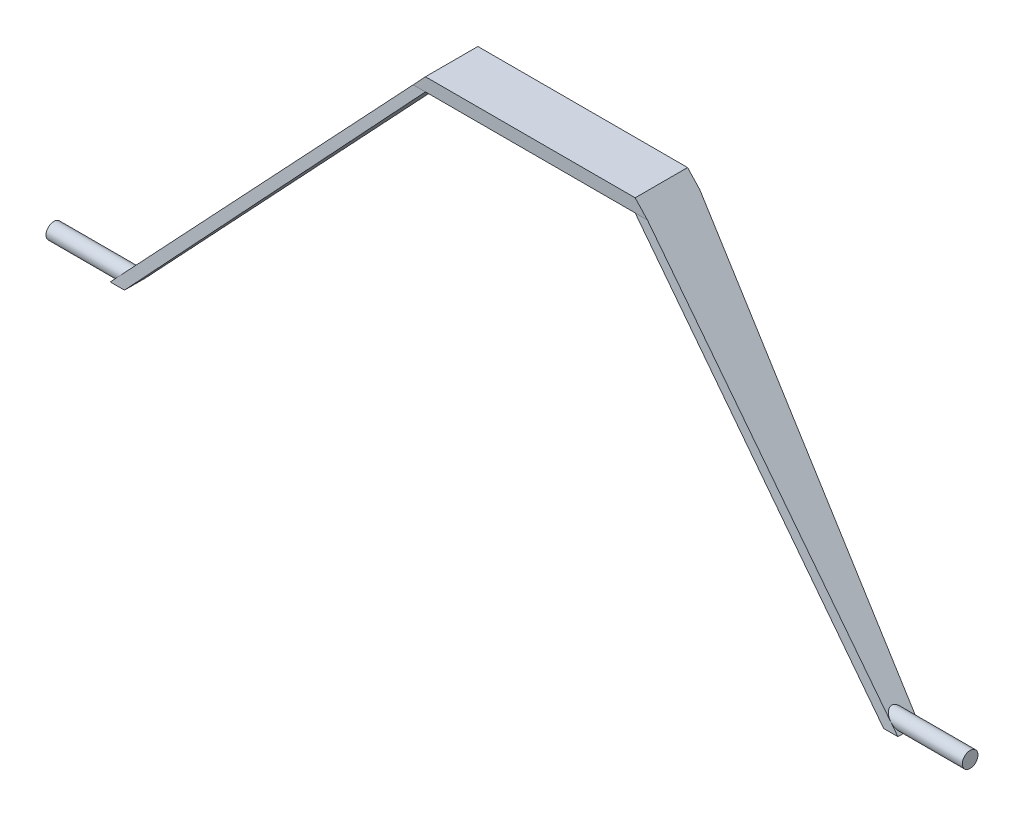
ISO-10303-21;
HEADER;
FILE_DESCRIPTION(('STEP AP214'),'2;1');
FILE_NAME('part.step','',(''),(''),'','','');
FILE_SCHEMA(('AUTOMOTIVE_DESIGN { 1 0 10303 214 1 1 1 1 }'));
ENDSEC;
DATA;
#1=APPLICATION_CONTEXT('core data for automotive mechanical design processes');
#2=APPLICATION_PROTOCOL_DEFINITION('international standard','automotive_design',2000,#1);
#3=PRODUCT_CONTEXT('',#1,'mechanical');
#4=PRODUCT('Part','Part','',(#3));
#5=PRODUCT_RELATED_PRODUCT_CATEGORY('part','',(#4));
#6=PRODUCT_DEFINITION_FORMATION('','',#4);
#7=PRODUCT_DEFINITION_CONTEXT('part definition',#1,'design');
#8=PRODUCT_DEFINITION('design','',#6,#7);
#9=PRODUCT_DEFINITION_SHAPE('','',#8);
#10=(LENGTH_UNIT() NAMED_UNIT(*) SI_UNIT(.MILLI.,.METRE.));
#11=(NAMED_UNIT(*) PLANE_ANGLE_UNIT() SI_UNIT($,.RADIAN.));
#12=(NAMED_UNIT(*) SI_UNIT($,.STERADIAN.) SOLID_ANGLE_UNIT());
#13=UNCERTAINTY_MEASURE_WITH_UNIT(LENGTH_MEASURE(1.E-05),#10,'distance_accuracy_value','');
#14=(GEOMETRIC_REPRESENTATION_CONTEXT(3) GLOBAL_UNCERTAINTY_ASSIGNED_CONTEXT((#13)) GLOBAL_UNIT_ASSIGNED_CONTEXT((#10,
#11,#12)) REPRESENTATION_CONTEXT('',''));
#15=CARTESIAN_POINT('',(0.,0.,0.));
#16=DIRECTION('',(0.,0.,1.));
#17=DIRECTION('',(1.,0.,0.));
#18=AXIS2_PLACEMENT_3D('',#15,#16,#17);
#19=CARTESIAN_POINT('',(-203.2,241.3,-101.6));
#20=DIRECTION('',(-0.730491181160132,0.682922128977583,0.));
#21=DIRECTION('',(-0.682922128977583,-0.730491181160132,0.));
#22=AXIS2_PLACEMENT_3D('',#19,#20,#21);
#23=PLANE('',#22);
#24=DIRECTION('',(0.,0.,-1.));
#25=VECTOR('',#24,1.);
#26=CARTESIAN_POINT('',(-763.250773789481,-357.761201703354,-101.600000000001));
#27=LINE('',#26,#25);
#28=CARTESIAN_POINT('',(-763.250773789482,-357.761201703355,50.8198320375984));
#29=VERTEX_POINT('',#28);
#30=CARTESIAN_POINT('',(-763.250773789482,-357.761201703355,34.29));
#31=VERTEX_POINT('',#30);
#32=EDGE_CURVE('E317',#29,#31,#27,.T.);
#33=ORIENTED_EDGE('',*,*,#32,.F.);
#34=DIRECTION('',(0.681496635621806,0.728966394832361,-0.0645780987740409));
#35=VECTOR('',#34,1.);
#36=CARTESIAN_POINT('',(-723.937929376007,-315.71001470586,47.094577037175));
#37=LINE('',#36,#35);
#38=CARTESIAN_POINT('',(-749.529378710232,-343.084040613829,49.519603158351));
#39=VERTEX_POINT('',#38);
#40=EDGE_CURVE('E193',#29,#39,#37,.T.);
#41=ORIENTED_EDGE('',*,*,#40,.T.);
#42=CARTESIAN_POINT('',(-749.003191458523,-342.521201703355,34.29));
#43=DIRECTION('',(-0.730491181160132,0.682922128977583,0.));
#44=DIRECTION('',(-0.682922128977583,-0.730491181160132,0.));
#45=AXIS2_PLACEMENT_3D('',#42,#43,#44);
#46=ELLIPSE('',#45,20.8626748591222,15.24);
#47=EDGE_CURVE('E173',#31,#39,#46,.T.);
#48=ORIENTED_EDGE('',*,*,#47,.F.);
#49=EDGE_LOOP('',(#33,#41,#48));
#50=FACE_BOUND('',#49,.T.);
#51=ADVANCED_FACE('F41',(#50),#23,.T.);
#52=CARTESIAN_POINT('',(203.2,241.3,-101.6));
#53=DIRECTION('',(0.730491181160132,0.682922128977584,0.));
#54=DIRECTION('',(-0.682922128977584,0.730491181160132,0.));
#55=AXIS2_PLACEMENT_3D('',#52,#53,#54);
#56=PLANE('',#55);
#57=DIRECTION('',(0.,0.,1.));
#58=VECTOR('',#57,1.);
#59=CARTESIAN_POINT('',(763.250773789482,-357.761201703355,-101.600000000001));
#60=LINE('',#59,#58);
#61=CARTESIAN_POINT('',(763.250773789482,-357.761201703355,9.71963208235841));
#62=VERTEX_POINT('',#61);
#63=CARTESIAN_POINT('',(763.250773789482,-357.761201703355,33.0074609456695));
#64=VERTEX_POINT('',#63);
#65=EDGE_CURVE('E140',#62,#64,#60,.T.);
#66=ORIENTED_EDGE('',*,*,#65,.F.);
#67=DIRECTION('',(0.676162571687912,-0.723260785805915,0.140349607636784));
#68=VECTOR('',#67,1.);
#69=CARTESIAN_POINT('',(716.188478747164,-307.420774830618,-0.0489870637551265));
#70=LINE('',#69,#68);
#71=CARTESIAN_POINT('',(226.945970551598,215.9,-101.6));
#72=VERTEX_POINT('',#71);
#73=EDGE_CURVE('E153',#72,#62,#70,.T.);
#74=ORIENTED_EDGE('',*,*,#73,.F.);
#75=DIRECTION('',(-0.682922128977583,0.730491181160132,0.));
#76=VECTOR('',#75,1.);
#77=CARTESIAN_POINT('',(203.2,241.3,-101.6));
#78=LINE('',#77,#76);
#79=CARTESIAN_POINT('',(203.2,241.3,-101.6));
#80=VERTEX_POINT('',#79);
#81=EDGE_CURVE('E227',#72,#80,#78,.T.);
#82=ORIENTED_EDGE('',*,*,#81,.T.);
#83=DIRECTION('',(0.,0.,1.));
#84=VECTOR('',#83,1.);
#85=CARTESIAN_POINT('',(203.2,241.3,-101.6));
#86=LINE('',#85,#84);
#87=CARTESIAN_POINT('',(203.2,241.3,0.));
#88=VERTEX_POINT('',#87);
#89=EDGE_CURVE('E239',#80,#88,#86,.T.);
#90=ORIENTED_EDGE('',*,*,#89,.T.);
#91=DIRECTION('',(-0.682922128977584,0.730491181160132,0.));
#92=VECTOR('',#91,1.);
#93=CARTESIAN_POINT('',(713.347967728877,-304.382407554465,0.));
#94=LINE('',#93,#92);
#95=CARTESIAN_POINT('',(226.945970551598,215.9,0.));
#96=VERTEX_POINT('',#95);
#97=EDGE_CURVE('E179',#96,#88,#94,.T.);
#98=ORIENTED_EDGE('',*,*,#97,.F.);
#99=DIRECTION('',(-0.681496635621806,0.728966394832361,-0.0645780987740408));
#100=VECTOR('',#99,1.);
#101=CARTESIAN_POINT('',(723.937929376008,-315.71001470586,47.094577037175));
#102=LINE('',#101,#100);
#103=CARTESIAN_POINT('',(763.250773789482,-357.761201703355,50.8198320375984));
#104=VERTEX_POINT('',#103);
#105=EDGE_CURVE('E181',#104,#96,#102,.T.);
#106=ORIENTED_EDGE('',*,*,#105,.F.);
#107=CARTESIAN_POINT('',(763.250773789482,-357.761201703355,35.2279876970949));
#108=VERTEX_POINT('',#107);
#109=EDGE_CURVE('E159',#108,#104,#60,.T.);
#110=ORIENTED_EDGE('',*,*,#109,.F.);
#111=CARTESIAN_POINT('',(749.041050591846,-342.561697920778,34.1177243213822));
#112=DIRECTION('',(0.730491181160132,0.682922128977584,0.));
#113=DIRECTION('',(0.682922128977584,-0.730491181160132,0.));
#114=AXIS2_PLACEMENT_3D('',#111,#112,#113);
#115=ELLIPSE('',#114,20.8626748591222,15.24);
#116=EDGE_CURVE('E50',#108,#64,#115,.F.);
#117=ORIENTED_EDGE('',*,*,#116,.T.);
#118=EDGE_LOOP('',(#66,#74,#82,#90,#98,#106,#110,#117));
#119=FACE_BOUND('',#118,.T.);
#120=ADVANCED_FACE('F152',(#119),#56,.T.);
#121=CARTESIAN_POINT('',(-763.250773789481,-357.761201703355,9.71963208235839));
#122=VERTEX_POINT('',#121);
#123=EDGE_CURVE('E57',#31,#122,#27,.T.);
#124=ORIENTED_EDGE('',*,*,#123,.F.);
#125=CARTESIAN_POINT('',(-745.982218014503,-339.289801861796,49.1834769299843));
#126=VERTEX_POINT('',#125);
#127=EDGE_CURVE('E166',#126,#31,#46,.T.);
#128=ORIENTED_EDGE('',*,*,#127,.F.);
#129=CARTESIAN_POINT('',(-226.945970551598,215.9,0.));
#130=VERTEX_POINT('',#129);
#131=EDGE_CURVE('E184',#126,#130,#37,.T.);
#132=ORIENTED_EDGE('',*,*,#131,.T.);
#133=DIRECTION('',(0.682922128977583,0.730491181160132,0.));
#134=VECTOR('',#133,1.);
#135=CARTESIAN_POINT('',(-713.347967728877,-304.382407554465,0.));
#136=LINE('',#135,#134);
#137=CARTESIAN_POINT('',(-203.2,241.3,0.));
#138=VERTEX_POINT('',#137);
#139=EDGE_CURVE('E187',#130,#138,#136,.T.);
#140=ORIENTED_EDGE('',*,*,#139,.T.);
#141=DIRECTION('',(0.,0.,1.));
#142=VECTOR('',#141,1.);
#143=CARTESIAN_POINT('',(-203.2,241.3,-101.6));
#144=LINE('',#143,#142);
#145=CARTESIAN_POINT('',(-203.2,241.3,-101.6));
#146=VERTEX_POINT('',#145);
#147=EDGE_CURVE('E235',#146,#138,#144,.T.);
#148=ORIENTED_EDGE('',*,*,#147,.F.);
#149=DIRECTION('',(-0.682922128977583,-0.730491181160132,0.));
#150=VECTOR('',#149,1.);
#151=CARTESIAN_POINT('',(-203.2,241.3,-101.6));
#152=LINE('',#151,#150);
#153=CARTESIAN_POINT('',(-226.945970551598,215.9,-101.6));
#154=VERTEX_POINT('',#153);
#155=EDGE_CURVE('E219',#146,#154,#152,.T.);
#156=ORIENTED_EDGE('',*,*,#155,.T.);
#157=DIRECTION('',(-0.676162571687912,-0.723260785805915,0.140349607636784));
#158=VECTOR('',#157,1.);
#159=CARTESIAN_POINT('',(-716.188478747163,-307.420774830618,-0.048987063755182));
#160=LINE('',#159,#158);
#161=EDGE_CURVE('E170',#154,#122,#160,.T.);
#162=ORIENTED_EDGE('',*,*,#161,.T.);
#163=EDGE_LOOP('',(#124,#128,#132,#140,#148,#156,#162));
#164=FACE_BOUND('',#163,.T.);
#165=ADVANCED_FACE('F43',(#164),#23,.T.);
#166=CARTESIAN_POINT('',(-203.2,241.3,-101.6));
#167=DIRECTION('',(0.,1.,0.));
#168=DIRECTION('',(-1.,0.,0.));
#169=AXIS2_PLACEMENT_3D('',#166,#167,#168);
#170=PLANE('',#169);
#171=DIRECTION('',(1.,0.,0.));
#172=VECTOR('',#171,1.);
#173=CARTESIAN_POINT('',(-1297.03997230565,241.3,0.));
#174=LINE('',#173,#172);
#175=EDGE_CURVE('E191',#138,#88,#174,.T.);
#176=ORIENTED_EDGE('',*,*,#175,.T.);
#177=ORIENTED_EDGE('',*,*,#89,.F.);
#178=DIRECTION('',(-1.,0.,0.));
#179=VECTOR('',#178,1.);
#180=CARTESIAN_POINT('',(-203.2,241.3,-101.6));
#181=LINE('',#180,#179);
#182=EDGE_CURVE('E230',#80,#146,#181,.T.);
#183=ORIENTED_EDGE('',*,*,#182,.T.);
#184=ORIENTED_EDGE('',*,*,#147,.T.);
#185=EDGE_LOOP('',(#176,#177,#183,#184));
#186=FACE_BOUND('',#185,.T.);
#187=ADVANCED_FACE('F298',(#186),#170,.T.);
#188=CARTESIAN_POINT('',(762.071663752112,-386.209201703355,-101.6));
#189=DIRECTION('',(-0.732932920293633,-0.680300914559025,0.));
#190=DIRECTION('',(0.680300914559025,-0.732932920293633,0.));
#191=AXIS2_PLACEMENT_3D('',#188,#189,#190);
#192=PLANE('',#191);
#193=DIRECTION('',(0.,0.,-1.));
#194=VECTOR('',#193,1.);
#195=CARTESIAN_POINT('',(735.666518231262,-357.761201703355,-101.6));
#196=LINE('',#195,#194);
#197=CARTESIAN_POINT('',(735.666518231262,-357.761201703355,50.8198320375984));
#198=VERTEX_POINT('',#197);
#199=CARTESIAN_POINT('',(735.666518231262,-357.761201703355,9.71963208235841));
#200=VERTEX_POINT('',#199);
#201=EDGE_CURVE('E142',#198,#200,#196,.T.);
#202=ORIENTED_EDGE('',*,*,#201,.F.);
#203=DIRECTION('',(0.678871413535743,-0.731392824819506,0.0647930527643605));
#204=VECTOR('',#203,1.);
#205=CARTESIAN_POINT('',(755.256449466988,-378.866723100837,52.6895402369698));
#206=LINE('',#205,#204);
#207=CARTESIAN_POINT('',(203.2,215.9,0.));
#208=VERTEX_POINT('',#207);
#209=EDGE_CURVE('E208',#208,#198,#206,.T.);
#210=ORIENTED_EDGE('',*,*,#209,.F.);
#211=DIRECTION('',(0.,0.,1.));
#212=VECTOR('',#211,1.);
#213=CARTESIAN_POINT('',(203.2,215.9,-101.6));
#214=LINE('',#213,#212);
#215=CARTESIAN_POINT('',(203.2,215.9,-101.6));
#216=VERTEX_POINT('',#215);
#217=EDGE_CURVE('E243',#216,#208,#214,.T.);
#218=ORIENTED_EDGE('',*,*,#217,.F.);
#219=DIRECTION('',(-0.673522882906171,0.725630500986452,-0.140809453659583));
#220=VECTOR('',#219,1.);
#221=CARTESIAN_POINT('',(750.990746361577,-374.271000579751,12.9233780062889));
#222=LINE('',#221,#220);
#223=EDGE_CURVE('E216',#200,#216,#222,.T.);
#224=ORIENTED_EDGE('',*,*,#223,.F.);
#225=EDGE_LOOP('',(#202,#210,#218,#224));
#226=FACE_BOUND('',#225,.T.);
#227=ADVANCED_FACE('F290',(#226),#192,.T.);
#228=CARTESIAN_POINT('',(-203.2,215.9,-101.6));
#229=DIRECTION('',(0.,-1.,0.));
#230=DIRECTION('',(1.,0.,0.));
#231=AXIS2_PLACEMENT_3D('',#228,#229,#230);
#232=PLANE('',#231);
#233=DIRECTION('',(1.,0.,0.));
#234=VECTOR('',#233,1.);
#235=CARTESIAN_POINT('',(-1297.03997230565,215.9,0.));
#236=LINE('',#235,#234);
#237=CARTESIAN_POINT('',(-203.2,215.9,0.));
#238=VERTEX_POINT('',#237);
#239=EDGE_CURVE('E205',#238,#208,#236,.T.);
#240=ORIENTED_EDGE('',*,*,#239,.F.);
#241=DIRECTION('',(0.,0.,1.));
#242=VECTOR('',#241,1.);
#243=CARTESIAN_POINT('',(-203.2,215.9,-101.6));
#244=LINE('',#243,#242);
#245=CARTESIAN_POINT('',(-203.2,215.9,-101.6));
#246=VERTEX_POINT('',#245);
#247=EDGE_CURVE('E234',#246,#238,#244,.T.);
#248=ORIENTED_EDGE('',*,*,#247,.F.);
#249=DIRECTION('',(1.,0.,0.));
#250=VECTOR('',#249,1.);
#251=CARTESIAN_POINT('',(-203.2,215.9,-101.6));
#252=LINE('',#251,#250);
#253=EDGE_CURVE('E223',#246,#216,#252,.T.);
#254=ORIENTED_EDGE('',*,*,#253,.T.);
#255=ORIENTED_EDGE('',*,*,#217,.T.);
#256=EDGE_LOOP('',(#240,#248,#254,#255));
#257=FACE_BOUND('',#256,.T.);
#258=ADVANCED_FACE('F281',(#257),#232,.T.);
#259=CARTESIAN_POINT('',(-762.071663752112,-386.209201703355,-101.6));
#260=DIRECTION('',(0.732932920293634,-0.680300914559025,0.));
#261=DIRECTION('',(0.680300914559025,0.732932920293634,0.));
#262=AXIS2_PLACEMENT_3D('',#259,#260,#261);
#263=PLANE('',#262);
#264=DIRECTION('',(0.,0.,1.));
#265=VECTOR('',#264,1.);
#266=CARTESIAN_POINT('',(-735.666518231261,-357.761201703355,-101.6));
#267=LINE('',#266,#265);
#268=CARTESIAN_POINT('',(-735.666518231261,-357.761201703355,9.71963208235841));
#269=VERTEX_POINT('',#268);
#270=CARTESIAN_POINT('',(-735.666518231261,-357.761201703355,50.8198320375984));
#271=VERTEX_POINT('',#270);
#272=EDGE_CURVE('E277',#269,#271,#267,.T.);
#273=ORIENTED_EDGE('',*,*,#272,.F.);
#274=DIRECTION('',(-0.673522882906171,-0.725630500986452,0.140809453659583));
#275=VECTOR('',#274,1.);
#276=CARTESIAN_POINT('',(-750.990746361577,-374.271000579751,12.9233780062889));
#277=LINE('',#276,#275);
#278=EDGE_CURVE('E212',#246,#269,#277,.T.);
#279=ORIENTED_EDGE('',*,*,#278,.F.);
#280=ORIENTED_EDGE('',*,*,#247,.T.);
#281=DIRECTION('',(0.678871413535743,0.731392824819506,-0.0647930527643606));
#282=VECTOR('',#281,1.);
#283=CARTESIAN_POINT('',(-755.256449466988,-378.866723100838,52.6895402369698));
#284=LINE('',#283,#282);
#285=EDGE_CURVE('E201',#271,#238,#284,.T.);
#286=ORIENTED_EDGE('',*,*,#285,.F.);
#287=EDGE_LOOP('',(#273,#279,#280,#286));
#288=FACE_BOUND('',#287,.T.);
#289=ADVANCED_FACE('F275',(#288),#263,.T.);
#290=CARTESIAN_POINT('',(0.,0.,-101.6));
#291=DIRECTION('',(0.,0.,1.));
#292=DIRECTION('',(1.,0.,0.));
#293=AXIS2_PLACEMENT_3D('',#290,#291,#292);
#294=PLANE('',#293);
#295=ORIENTED_EDGE('',*,*,#81,.F.);
#296=DIRECTION('',(-1.,0.,0.));
#297=VECTOR('',#296,1.);
#298=CARTESIAN_POINT('',(0.,215.9,-101.6));
#299=LINE('',#298,#297);
#300=EDGE_CURVE('E163',#72,#216,#299,.T.);
#301=ORIENTED_EDGE('',*,*,#300,.T.);
#302=ORIENTED_EDGE('',*,*,#253,.F.);
#303=DIRECTION('',(1.,0.,0.));
#304=VECTOR('',#303,1.);
#305=CARTESIAN_POINT('',(-1297.03997230565,215.9,-101.6));
#306=LINE('',#305,#304);
#307=EDGE_CURVE('E165',#154,#246,#306,.T.);
#308=ORIENTED_EDGE('',*,*,#307,.F.);
#309=ORIENTED_EDGE('',*,*,#155,.F.);
#310=ORIENTED_EDGE('',*,*,#182,.F.);
#311=EDGE_LOOP('',(#295,#301,#302,#308,#309,#310));
#312=FACE_BOUND('',#311,.T.);
#313=ADVANCED_FACE('F284',(#312),#294,.F.);
#314=CARTESIAN_POINT('',(-1297.03997230565,215.9,0.));
#315=DIRECTION('',(0.,-0.0882429953418222,-0.996098977899839));
#316=DIRECTION('',(0.,0.996098977899839,-0.0882429953418222));
#317=AXIS2_PLACEMENT_3D('',#314,#315,#316);
#318=PLANE('',#317);
#319=ORIENTED_EDGE('',*,*,#209,.T.);
#320=DIRECTION('',(1.,0.,0.));
#321=VECTOR('',#320,1.);
#322=CARTESIAN_POINT('',(-1297.03997230565,-357.761201703355,50.8198320375984));
#323=LINE('',#322,#321);
#324=EDGE_CURVE('E158',#198,#104,#323,.T.);
#325=ORIENTED_EDGE('',*,*,#324,.T.);
#326=ORIENTED_EDGE('',*,*,#105,.T.);
#327=EDGE_CURVE('E196',#208,#96,#236,.T.);
#328=ORIENTED_EDGE('',*,*,#327,.F.);
#329=EDGE_LOOP('',(#319,#325,#326,#328));
#330=FACE_BOUND('',#329,.T.);
#331=ADVANCED_FACE('F293',(#330),#318,.F.);
#332=ORIENTED_EDGE('',*,*,#40,.F.);
#333=DIRECTION('',(1.,0.,0.));
#334=VECTOR('',#333,1.);
#335=CARTESIAN_POINT('',(-1297.03997230565,-357.761201703355,50.8198320375984));
#336=LINE('',#335,#334);
#337=EDGE_CURVE('E272',#29,#271,#336,.T.);
#338=ORIENTED_EDGE('',*,*,#337,.T.);
#339=ORIENTED_EDGE('',*,*,#285,.T.);
#340=EDGE_CURVE('E192',#130,#238,#236,.T.);
#341=ORIENTED_EDGE('',*,*,#340,.F.);
#342=ORIENTED_EDGE('',*,*,#131,.F.);
#343=EDGE_CURVE('E197',#39,#126,#37,.T.);
#344=ORIENTED_EDGE('',*,*,#343,.F.);
#345=EDGE_LOOP('',(#332,#338,#339,#341,#342,#344));
#346=FACE_BOUND('',#345,.T.);
#347=ADVANCED_FACE('F269',(#346),#318,.F.);
#348=CARTESIAN_POINT('',(-1297.03997230565,241.3,0.));
#349=DIRECTION('',(0.,0.,-1.));
#350=DIRECTION('',(-1.,0.,0.));
#351=AXIS2_PLACEMENT_3D('',#348,#349,#350);
#352=PLANE('',#351);
#353=ORIENTED_EDGE('',*,*,#340,.T.);
#354=ORIENTED_EDGE('',*,*,#239,.T.);
#355=ORIENTED_EDGE('',*,*,#327,.T.);
#356=ORIENTED_EDGE('',*,*,#97,.T.);
#357=ORIENTED_EDGE('',*,*,#175,.F.);
#358=ORIENTED_EDGE('',*,*,#139,.F.);
#359=EDGE_LOOP('',(#353,#354,#355,#356,#357,#358));
#360=FACE_BOUND('',#359,.T.);
#361=ADVANCED_FACE('F266',(#360),#352,.F.);
#362=CARTESIAN_POINT('',(-1297.03997230565,215.9,-101.6));
#363=DIRECTION('',(0.,0.190497645594452,0.981687652475557));
#364=DIRECTION('',(0.,-0.981687652475557,0.190497645594452));
#365=AXIS2_PLACEMENT_3D('',#362,#363,#364);
#366=PLANE('',#365);
#367=ORIENTED_EDGE('',*,*,#278,.T.);
#368=DIRECTION('',(-1.,0.,0.));
#369=VECTOR('',#368,1.);
#370=CARTESIAN_POINT('',(960.161483369765,-357.761201703355,9.71963208235841));
#371=LINE('',#370,#369);
#372=EDGE_CURVE('E147',#269,#122,#371,.T.);
#373=ORIENTED_EDGE('',*,*,#372,.T.);
#374=ORIENTED_EDGE('',*,*,#161,.F.);
#375=ORIENTED_EDGE('',*,*,#307,.T.);
#376=EDGE_LOOP('',(#367,#373,#374,#375));
#377=FACE_BOUND('',#376,.T.);
#378=ADVANCED_FACE('F301',(#377),#366,.F.);
#379=ORIENTED_EDGE('',*,*,#73,.T.);
#380=EDGE_CURVE('E137',#62,#200,#371,.T.);
#381=ORIENTED_EDGE('',*,*,#380,.T.);
#382=ORIENTED_EDGE('',*,*,#223,.T.);
#383=ORIENTED_EDGE('',*,*,#300,.F.);
#384=EDGE_LOOP('',(#379,#381,#382,#383));
#385=FACE_BOUND('',#384,.T.);
#386=ADVANCED_FACE('F161',(#385),#366,.F.);
#387=CARTESIAN_POINT('',(-203.2,241.3,-101.6));
#388=DIRECTION('',(-0.730491181160132,0.682922128977583,0.));
#389=DIRECTION('',(-0.682922128977583,-0.730491181160132,0.));
#390=AXIS2_PLACEMENT_3D('',#387,#388,#389);
#391=PLANE('',#390);
#392=CARTESIAN_POINT('',(-749.003191458523,-342.521201703355,34.29));
#393=DIRECTION('',(-0.730491181160132,0.682922128977583,0.));
#394=DIRECTION('',(-0.682922128977583,-0.730491181160132,0.));
#395=AXIS2_PLACEMENT_3D('',#392,#393,#394);
#396=ELLIPSE('',#395,20.8626748591222,15.24);
#397=EDGE_CURVE('E329',#126,#39,#396,.F.);
#398=ORIENTED_EDGE('',*,*,#397,.T.);
#399=ORIENTED_EDGE('',*,*,#343,.T.);
#400=EDGE_LOOP('',(#398,#399));
#401=FACE_BOUND('',#400,.T.);
#402=ADVANCED_FACE('F341',(#401),#391,.F.);
#403=CARTESIAN_POINT('',(-697.946299034806,-342.521201703355,34.29));
#404=DIRECTION('',(-1.,0.,0.));
#405=DIRECTION('',(0.,0.,1.));
#406=AXIS2_PLACEMENT_3D('',#403,#404,#405);
#407=CYLINDRICAL_SURFACE('',#406,15.24);
#408=ORIENTED_EDGE('',*,*,#127,.T.);
#409=ORIENTED_EDGE('',*,*,#47,.T.);
#410=ORIENTED_EDGE('',*,*,#397,.F.);
#411=EDGE_LOOP('',(#408,#409,#410));
#412=FACE_BOUND('',#411,.T.);
#413=CARTESIAN_POINT('',(-889.071663752112,-342.521201703355,34.29));
#414=DIRECTION('',(-1.,0.,0.));
#415=DIRECTION('',(0.,0.,1.));
#416=AXIS2_PLACEMENT_3D('',#413,#414,#415);
#417=CIRCLE('',#416,15.24);
#418=CARTESIAN_POINT('',(-889.071663752112,-342.521201703355,49.53));
#419=VERTEX_POINT('',#418);
#420=EDGE_CURVE('E326',#419,#419,#417,.T.);
#421=ORIENTED_EDGE('',*,*,#420,.F.);
#422=EDGE_LOOP('',(#421));
#423=FACE_BOUND('',#422,.T.);
#424=ADVANCED_FACE('F337',(#412,#423),#407,.T.);
#425=CARTESIAN_POINT('',(-889.071663752112,-342.521201703355,34.29));
#426=DIRECTION('',(-1.,0.,0.));
#427=DIRECTION('',(0.,0.,1.));
#428=AXIS2_PLACEMENT_3D('',#425,#426,#427);
#429=PLANE('',#428);
#430=ORIENTED_EDGE('',*,*,#420,.T.);
#431=EDGE_LOOP('',(#430));
#432=FACE_BOUND('',#431,.T.);
#433=ADVANCED_FACE('F348',(#432),#429,.T.);
#434=CARTESIAN_POINT('',(697.984158168129,-342.561697920778,34.1177243213822));
#435=DIRECTION('',(1.,0.,0.));
#436=DIRECTION('',(0.,0.,-1.));
#437=AXIS2_PLACEMENT_3D('',#434,#435,#436);
#438=CYLINDRICAL_SURFACE('',#437,15.24);
#439=ORIENTED_EDGE('',*,*,#116,.F.);
#440=DIRECTION('',(1.,0.,0.));
#441=VECTOR('',#440,1.);
#442=CARTESIAN_POINT('',(697.984158168129,-357.761201703355,35.2279876970949));
#443=LINE('',#442,#441);
#444=CARTESIAN_POINT('',(886.531663752112,-357.761201703355,35.2279876970949));
#445=VERTEX_POINT('',#444);
#446=EDGE_CURVE('E306',#108,#445,#443,.T.);
#447=ORIENTED_EDGE('',*,*,#446,.T.);
#448=CARTESIAN_POINT('',(886.531663752112,-342.561697920778,34.1177243213822));
#449=DIRECTION('',(-1.,0.,0.));
#450=DIRECTION('',(0.,0.,1.));
#451=AXIS2_PLACEMENT_3D('',#448,#449,#450);
#452=CIRCLE('',#451,15.24);
#453=CARTESIAN_POINT('',(886.531663752112,-357.761201703355,33.0074609456695));
#454=VERTEX_POINT('',#453);
#455=EDGE_CURVE('E322',#445,#454,#452,.T.);
#456=ORIENTED_EDGE('',*,*,#455,.T.);
#457=DIRECTION('',(1.,0.,0.));
#458=VECTOR('',#457,1.);
#459=CARTESIAN_POINT('',(697.984158168129,-357.761201703355,33.0074609456695));
#460=LINE('',#459,#458);
#461=EDGE_CURVE('E65',#454,#64,#460,.F.);
#462=ORIENTED_EDGE('',*,*,#461,.T.);
#463=EDGE_LOOP('',(#439,#447,#456,#462));
#464=FACE_BOUND('',#463,.T.);
#465=ADVANCED_FACE('F408',(#464),#438,.T.);
#466=CARTESIAN_POINT('',(886.531663752112,-342.561697920778,34.1177243213822));
#467=DIRECTION('',(-1.,0.,0.));
#468=DIRECTION('',(0.,0.,1.));
#469=AXIS2_PLACEMENT_3D('',#466,#467,#468);
#470=PLANE('',#469);
#471=ORIENTED_EDGE('',*,*,#455,.F.);
#472=DIRECTION('',(0.,0.,-1.));
#473=VECTOR('',#472,1.);
#474=CARTESIAN_POINT('',(886.531663752112,-357.761201703355,34.1177243213822));
#475=LINE('',#474,#473);
#476=EDGE_CURVE('E11',#445,#454,#475,.T.);
#477=ORIENTED_EDGE('',*,*,#476,.T.);
#478=EDGE_LOOP('',(#471,#477));
#479=FACE_BOUND('',#478,.T.);
#480=ADVANCED_FACE('F418',(#479),#470,.F.);
#481=CARTESIAN_POINT('',(960.161483369765,-357.761201703355,53.34));
#482=DIRECTION('',(0.,1.,0.));
#483=DIRECTION('',(0.,0.,1.));
#484=AXIS2_PLACEMENT_3D('',#481,#482,#483);
#485=PLANE('',#484);
#486=ORIENTED_EDGE('',*,*,#201,.T.);
#487=ORIENTED_EDGE('',*,*,#380,.F.);
#488=ORIENTED_EDGE('',*,*,#65,.T.);
#489=ORIENTED_EDGE('',*,*,#461,.F.);
#490=ORIENTED_EDGE('',*,*,#476,.F.);
#491=ORIENTED_EDGE('',*,*,#446,.F.);
#492=ORIENTED_EDGE('',*,*,#109,.T.);
#493=ORIENTED_EDGE('',*,*,#324,.F.);
#494=EDGE_LOOP('',(#486,#487,#488,#489,#490,#491,#492,#493));
#495=FACE_BOUND('',#494,.T.);
#496=ADVANCED_FACE('F139',(#495),#485,.F.);
#497=ORIENTED_EDGE('',*,*,#32,.T.);
#498=ORIENTED_EDGE('',*,*,#123,.T.);
#499=ORIENTED_EDGE('',*,*,#372,.F.);
#500=ORIENTED_EDGE('',*,*,#272,.T.);
#501=ORIENTED_EDGE('',*,*,#337,.F.);
#502=EDGE_LOOP('',(#497,#498,#499,#500,#501));
#503=FACE_BOUND('',#502,.T.);
#504=ADVANCED_FACE('F437',(#503),#485,.F.);
#505=CLOSED_SHELL('',(#51,#120,#165,#187,#227,#258,#289,#313,#331,#347,#361,#378,#386,#402,#424,
#433,#465,#480,#496,#504));
#506=MANIFOLD_SOLID_BREP('B2',#505);
#507=ADVANCED_BREP_SHAPE_REPRESENTATION('',(#18,#506),#14);
#508=SHAPE_DEFINITION_REPRESENTATION(#9,#507);
ENDSEC;
END-ISO-10303-21;
